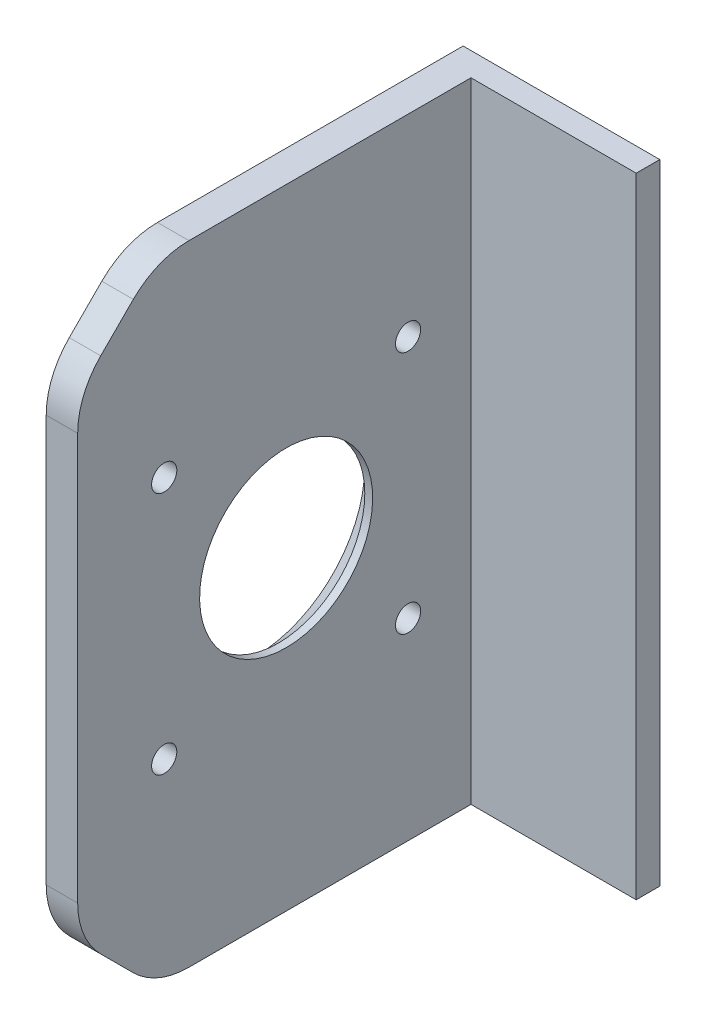
ISO-10303-21;
HEADER;
FILE_DESCRIPTION(('STEP AP214'),'2;1');
FILE_NAME('part.step','',(''),(''),'','','');
FILE_SCHEMA(('AUTOMOTIVE_DESIGN { 1 0 10303 214 1 1 1 1 }'));
ENDSEC;
DATA;
#1=APPLICATION_CONTEXT('core data for automotive mechanical design processes');
#2=APPLICATION_PROTOCOL_DEFINITION('international standard','automotive_design',2000,#1);
#3=PRODUCT_CONTEXT('',#1,'mechanical');
#4=PRODUCT('Part','Part','',(#3));
#5=PRODUCT_RELATED_PRODUCT_CATEGORY('part','',(#4));
#6=PRODUCT_DEFINITION_FORMATION('','',#4);
#7=PRODUCT_DEFINITION_CONTEXT('part definition',#1,'design');
#8=PRODUCT_DEFINITION('design','',#6,#7);
#9=PRODUCT_DEFINITION_SHAPE('','',#8);
#10=(LENGTH_UNIT() NAMED_UNIT(*) SI_UNIT(.MILLI.,.METRE.));
#11=(NAMED_UNIT(*) PLANE_ANGLE_UNIT() SI_UNIT($,.RADIAN.));
#12=(NAMED_UNIT(*) SI_UNIT($,.STERADIAN.) SOLID_ANGLE_UNIT());
#13=UNCERTAINTY_MEASURE_WITH_UNIT(LENGTH_MEASURE(1.E-05),#10,'distance_accuracy_value','');
#14=(GEOMETRIC_REPRESENTATION_CONTEXT(3) GLOBAL_UNCERTAINTY_ASSIGNED_CONTEXT((#13)) GLOBAL_UNIT_ASSIGNED_CONTEXT((#10,
#11,#12)) REPRESENTATION_CONTEXT('',''));
#15=CARTESIAN_POINT('',(0.,0.,0.));
#16=DIRECTION('',(0.,0.,1.));
#17=DIRECTION('',(1.,0.,0.));
#18=AXIS2_PLACEMENT_3D('',#15,#16,#17);
#19=CARTESIAN_POINT('',(-12.5,40.,3.));
#20=DIRECTION('',(1.,0.,0.));
#21=DIRECTION('',(0.,0.,-1.));
#22=AXIS2_PLACEMENT_3D('',#19,#20,#21);
#23=PLANE('',#22);
#24=CARTESIAN_POINT('',(-12.5,0.,26.5));
#25=DIRECTION('',(1.,0.,0.));
#26=DIRECTION('',(0.,0.,-1.));
#27=AXIS2_PLACEMENT_3D('',#24,#25,#26);
#28=CIRCLE('',#27,14.);
#29=CARTESIAN_POINT('',(-12.5,0.,12.5));
#30=VERTEX_POINT('',#29);
#31=EDGE_CURVE('E11',#30,#30,#28,.T.);
#32=ORIENTED_EDGE('',*,*,#31,.T.);
#33=EDGE_LOOP('',(#32));
#34=FACE_BOUND('',#33,.T.);
#35=CARTESIAN_POINT('',(-12.5,15.5,42.));
#36=DIRECTION('',(-1.,0.,0.));
#37=DIRECTION('',(0.,0.,1.));
#38=AXIS2_PLACEMENT_3D('',#35,#36,#37);
#39=CIRCLE('',#38,1.6);
#40=CARTESIAN_POINT('',(-12.5,15.5,43.6));
#41=VERTEX_POINT('',#40);
#42=EDGE_CURVE('E525',#41,#41,#39,.T.);
#43=ORIENTED_EDGE('',*,*,#42,.F.);
#44=EDGE_LOOP('',(#43));
#45=FACE_BOUND('',#44,.T.);
#46=CARTESIAN_POINT('',(-12.5,-15.5,11.));
#47=DIRECTION('',(-1.,0.,0.));
#48=DIRECTION('',(0.,0.,1.));
#49=AXIS2_PLACEMENT_3D('',#46,#47,#48);
#50=CIRCLE('',#49,1.6);
#51=CARTESIAN_POINT('',(-12.5,-15.5,12.6));
#52=VERTEX_POINT('',#51);
#53=EDGE_CURVE('E512',#52,#52,#50,.T.);
#54=ORIENTED_EDGE('',*,*,#53,.F.);
#55=EDGE_LOOP('',(#54));
#56=FACE_BOUND('',#55,.T.);
#57=CARTESIAN_POINT('',(-12.5,-15.5,42.));
#58=DIRECTION('',(-1.,0.,0.));
#59=DIRECTION('',(0.,0.,1.));
#60=AXIS2_PLACEMENT_3D('',#57,#58,#59);
#61=CIRCLE('',#60,1.6);
#62=CARTESIAN_POINT('',(-12.5,-15.5,43.6));
#63=VERTEX_POINT('',#62);
#64=EDGE_CURVE('E526',#63,#63,#61,.T.);
#65=ORIENTED_EDGE('',*,*,#64,.F.);
#66=EDGE_LOOP('',(#65));
#67=FACE_BOUND('',#66,.T.);
#68=CARTESIAN_POINT('',(-12.5,15.5,11.));
#69=DIRECTION('',(-1.,0.,0.));
#70=DIRECTION('',(0.,0.,1.));
#71=AXIS2_PLACEMENT_3D('',#68,#69,#70);
#72=CIRCLE('',#71,1.6);
#73=CARTESIAN_POINT('',(-12.5,15.5,12.6));
#74=VERTEX_POINT('',#73);
#75=EDGE_CURVE('E279',#74,#74,#72,.T.);
#76=ORIENTED_EDGE('',*,*,#75,.F.);
#77=EDGE_LOOP('',(#76));
#78=FACE_BOUND('',#77,.T.);
#79=DIRECTION('',(0.,0.,-1.));
#80=VECTOR('',#79,1.);
#81=CARTESIAN_POINT('',(-12.5,-40.,3.));
#82=LINE('',#81,#80);
#83=CARTESIAN_POINT('',(-12.5,-40.,38.857864376269));
#84=VERTEX_POINT('',#83);
#85=CARTESIAN_POINT('',(-12.5,-40.,0.));
#86=VERTEX_POINT('',#85);
#87=EDGE_CURVE('E209',#84,#86,#82,.T.);
#88=ORIENTED_EDGE('',*,*,#87,.F.);
#89=CARTESIAN_POINT('',(-12.5,-30.,38.857864376269));
#90=DIRECTION('',(1.,0.,0.));
#91=DIRECTION('',(0.,0.,-1.));
#92=AXIS2_PLACEMENT_3D('',#89,#90,#91);
#93=CIRCLE('',#92,10.);
#94=CARTESIAN_POINT('',(-12.5,-37.0710678118655,45.9289321881345));
#95=VERTEX_POINT('',#94);
#96=EDGE_CURVE('E239',#84,#95,#93,.F.);
#97=ORIENTED_EDGE('',*,*,#96,.T.);
#98=DIRECTION('',(0.,0.707106781186547,0.707106781186549));
#99=VECTOR('',#98,1.);
#100=CARTESIAN_POINT('',(-12.5,-30.,53.));
#101=LINE('',#100,#99);
#102=CARTESIAN_POINT('',(-12.5,-32.9289321881345,50.0710678118655));
#103=VERTEX_POINT('',#102);
#104=EDGE_CURVE('E222',#95,#103,#101,.T.);
#105=ORIENTED_EDGE('',*,*,#104,.T.);
#106=CARTESIAN_POINT('',(-12.5,-25.857864376269,43.));
#107=DIRECTION('',(1.,0.,0.));
#108=DIRECTION('',(0.,0.,-1.));
#109=AXIS2_PLACEMENT_3D('',#106,#107,#108);
#110=CIRCLE('',#109,10.);
#111=CARTESIAN_POINT('',(-12.5,-25.857864376269,53.));
#112=VERTEX_POINT('',#111);
#113=EDGE_CURVE('E236',#103,#112,#110,.F.);
#114=ORIENTED_EDGE('',*,*,#113,.T.);
#115=DIRECTION('',(0.,-1.,0.));
#116=VECTOR('',#115,1.);
#117=CARTESIAN_POINT('',(-12.5,40.,53.));
#118=LINE('',#117,#116);
#119=CARTESIAN_POINT('',(-12.5,25.857864376269,53.));
#120=VERTEX_POINT('',#119);
#121=EDGE_CURVE('E167',#120,#112,#118,.T.);
#122=ORIENTED_EDGE('',*,*,#121,.F.);
#123=CARTESIAN_POINT('',(-12.5,25.857864376269,43.));
#124=DIRECTION('',(1.,0.,0.));
#125=DIRECTION('',(0.,0.,-1.));
#126=AXIS2_PLACEMENT_3D('',#123,#124,#125);
#127=CIRCLE('',#126,10.);
#128=CARTESIAN_POINT('',(-12.5,32.9289321881345,50.0710678118655));
#129=VERTEX_POINT('',#128);
#130=EDGE_CURVE('E233',#120,#129,#127,.F.);
#131=ORIENTED_EDGE('',*,*,#130,.T.);
#132=DIRECTION('',(0.,0.707106781186547,-0.707106781186549));
#133=VECTOR('',#132,1.);
#134=CARTESIAN_POINT('',(-12.5,30.,53.));
#135=LINE('',#134,#133);
#136=CARTESIAN_POINT('',(-12.5,37.0710678118655,45.9289321881345));
#137=VERTEX_POINT('',#136);
#138=EDGE_CURVE('E218',#129,#137,#135,.T.);
#139=ORIENTED_EDGE('',*,*,#138,.T.);
#140=CARTESIAN_POINT('',(-12.5,30.,38.857864376269));
#141=DIRECTION('',(1.,0.,0.));
#142=DIRECTION('',(0.,0.,-1.));
#143=AXIS2_PLACEMENT_3D('',#140,#141,#142);
#144=CIRCLE('',#143,10.);
#145=CARTESIAN_POINT('',(-12.5,40.,38.857864376269));
#146=VERTEX_POINT('',#145);
#147=EDGE_CURVE('E230',#137,#146,#144,.F.);
#148=ORIENTED_EDGE('',*,*,#147,.T.);
#149=DIRECTION('',(0.,0.,-1.));
#150=VECTOR('',#149,1.);
#151=CARTESIAN_POINT('',(-12.5,40.,3.));
#152=LINE('',#151,#150);
#153=CARTESIAN_POINT('',(-12.5,40.,0.));
#154=VERTEX_POINT('',#153);
#155=EDGE_CURVE('E161',#146,#154,#152,.T.);
#156=ORIENTED_EDGE('',*,*,#155,.T.);
#157=DIRECTION('',(0.,-1.,0.));
#158=VECTOR('',#157,1.);
#159=CARTESIAN_POINT('',(-12.5,40.,0.));
#160=LINE('',#159,#158);
#161=EDGE_CURVE('E181',#154,#86,#160,.T.);
#162=ORIENTED_EDGE('',*,*,#161,.T.);
#163=EDGE_LOOP('',(#88,#97,#105,#114,#122,#131,#139,#148,#156,#162));
#164=FACE_BOUND('',#163,.T.);
#165=ADVANCED_FACE('F47',(#34,#45,#56,#67,#78,#164),#23,.F.);
#166=CARTESIAN_POINT('',(-12.5,-40.,3.));
#167=DIRECTION('',(0.,1.,0.));
#168=DIRECTION('',(-1.,0.,0.));
#169=AXIS2_PLACEMENT_3D('',#166,#167,#168);
#170=PLANE('',#169);
#171=DIRECTION('',(0.,0.,-1.));
#172=VECTOR('',#171,1.);
#173=CARTESIAN_POINT('',(-8.49999999999999,-40.,53.));
#174=LINE('',#173,#172);
#175=CARTESIAN_POINT('',(-8.49999999999999,-40.,38.857864376269));
#176=VERTEX_POINT('',#175);
#177=CARTESIAN_POINT('',(-8.5,-40.,3.));
#178=VERTEX_POINT('',#177);
#179=EDGE_CURVE('E149',#176,#178,#174,.T.);
#180=ORIENTED_EDGE('',*,*,#179,.F.);
#181=DIRECTION('',(-1.,0.,0.));
#182=VECTOR('',#181,1.);
#183=CARTESIAN_POINT('',(-12.5,-40.,38.857864376269));
#184=LINE('',#183,#182);
#185=EDGE_CURVE('E226',#176,#84,#184,.T.);
#186=ORIENTED_EDGE('',*,*,#185,.T.);
#187=ORIENTED_EDGE('',*,*,#87,.T.);
#188=DIRECTION('',(1.,0.,0.));
#189=VECTOR('',#188,1.);
#190=CARTESIAN_POINT('',(-12.5,-40.,0.));
#191=LINE('',#190,#189);
#192=CARTESIAN_POINT('',(12.5,-40.,0.));
#193=VERTEX_POINT('',#192);
#194=EDGE_CURVE('E191',#86,#193,#191,.T.);
#195=ORIENTED_EDGE('',*,*,#194,.T.);
#196=DIRECTION('',(0.,0.,-1.));
#197=VECTOR('',#196,1.);
#198=CARTESIAN_POINT('',(12.5,-40.,3.));
#199=LINE('',#198,#197);
#200=CARTESIAN_POINT('',(12.5,-40.,3.));
#201=VERTEX_POINT('',#200);
#202=EDGE_CURVE('E205',#201,#193,#199,.T.);
#203=ORIENTED_EDGE('',*,*,#202,.F.);
#204=DIRECTION('',(1.,0.,0.));
#205=VECTOR('',#204,1.);
#206=CARTESIAN_POINT('',(-12.5,-40.,3.));
#207=LINE('',#206,#205);
#208=EDGE_CURVE('E182',#178,#201,#207,.T.);
#209=ORIENTED_EDGE('',*,*,#208,.F.);
#210=EDGE_LOOP('',(#180,#186,#187,#195,#203,#209));
#211=FACE_BOUND('',#210,.T.);
#212=ADVANCED_FACE('F308',(#211),#170,.F.);
#213=CARTESIAN_POINT('',(12.5,40.,3.));
#214=DIRECTION('',(-1.,0.,0.));
#215=DIRECTION('',(0.,0.,1.));
#216=AXIS2_PLACEMENT_3D('',#213,#214,#215);
#217=PLANE('',#216);
#218=DIRECTION('',(0.,1.,0.));
#219=VECTOR('',#218,1.);
#220=CARTESIAN_POINT('',(12.5,40.,0.));
#221=LINE('',#220,#219);
#222=CARTESIAN_POINT('',(12.5,40.,0.));
#223=VERTEX_POINT('',#222);
#224=EDGE_CURVE('E194',#193,#223,#221,.T.);
#225=ORIENTED_EDGE('',*,*,#224,.T.);
#226=DIRECTION('',(0.,0.,-1.));
#227=VECTOR('',#226,1.);
#228=CARTESIAN_POINT('',(12.5,40.,3.));
#229=LINE('',#228,#227);
#230=CARTESIAN_POINT('',(12.5,40.,3.));
#231=VERTEX_POINT('',#230);
#232=EDGE_CURVE('E202',#231,#223,#229,.T.);
#233=ORIENTED_EDGE('',*,*,#232,.F.);
#234=DIRECTION('',(0.,1.,0.));
#235=VECTOR('',#234,1.);
#236=CARTESIAN_POINT('',(12.5,40.,3.));
#237=LINE('',#236,#235);
#238=EDGE_CURVE('E158',#201,#231,#237,.T.);
#239=ORIENTED_EDGE('',*,*,#238,.F.);
#240=ORIENTED_EDGE('',*,*,#202,.T.);
#241=EDGE_LOOP('',(#225,#233,#239,#240));
#242=FACE_BOUND('',#241,.T.);
#243=ADVANCED_FACE('F314',(#242),#217,.F.);
#244=CARTESIAN_POINT('',(-12.5,40.,3.));
#245=DIRECTION('',(0.,-1.,0.));
#246=DIRECTION('',(0.,0.,-1.));
#247=AXIS2_PLACEMENT_3D('',#244,#245,#246);
#248=PLANE('',#247);
#249=ORIENTED_EDGE('',*,*,#155,.F.);
#250=DIRECTION('',(1.,0.,0.));
#251=VECTOR('',#250,1.);
#252=CARTESIAN_POINT('',(-8.5,40.,38.857864376269));
#253=LINE('',#252,#251);
#254=CARTESIAN_POINT('',(-8.5,40.,38.857864376269));
#255=VERTEX_POINT('',#254);
#256=EDGE_CURVE('E146',#146,#255,#253,.T.);
#257=ORIENTED_EDGE('',*,*,#256,.T.);
#258=DIRECTION('',(0.,0.,-1.));
#259=VECTOR('',#258,1.);
#260=CARTESIAN_POINT('',(-8.5,40.,53.));
#261=LINE('',#260,#259);
#262=CARTESIAN_POINT('',(-8.5,40.,3.));
#263=VERTEX_POINT('',#262);
#264=EDGE_CURVE('E139',#255,#263,#261,.T.);
#265=ORIENTED_EDGE('',*,*,#264,.T.);
#266=DIRECTION('',(-1.,0.,0.));
#267=VECTOR('',#266,1.);
#268=CARTESIAN_POINT('',(-12.5,40.,3.));
#269=LINE('',#268,#267);
#270=EDGE_CURVE('E144',#231,#263,#269,.T.);
#271=ORIENTED_EDGE('',*,*,#270,.F.);
#272=ORIENTED_EDGE('',*,*,#232,.T.);
#273=DIRECTION('',(-1.,0.,0.));
#274=VECTOR('',#273,1.);
#275=CARTESIAN_POINT('',(-12.5,40.,0.));
#276=LINE('',#275,#274);
#277=EDGE_CURVE('E185',#223,#154,#276,.T.);
#278=ORIENTED_EDGE('',*,*,#277,.T.);
#279=EDGE_LOOP('',(#249,#257,#265,#271,#272,#278));
#280=FACE_BOUND('',#279,.T.);
#281=ADVANCED_FACE('F142',(#280),#248,.F.);
#282=CARTESIAN_POINT('',(0.,0.,3.));
#283=DIRECTION('',(0.,0.,1.));
#284=DIRECTION('',(1.,0.,0.));
#285=AXIS2_PLACEMENT_3D('',#282,#283,#284);
#286=PLANE('',#285);
#287=DIRECTION('',(0.,1.,0.));
#288=VECTOR('',#287,1.);
#289=CARTESIAN_POINT('',(-8.5,40.,3.));
#290=LINE('',#289,#288);
#291=EDGE_CURVE('E155',#178,#263,#290,.T.);
#292=ORIENTED_EDGE('',*,*,#291,.F.);
#293=ORIENTED_EDGE('',*,*,#208,.T.);
#294=ORIENTED_EDGE('',*,*,#238,.T.);
#295=ORIENTED_EDGE('',*,*,#270,.T.);
#296=EDGE_LOOP('',(#292,#293,#294,#295));
#297=FACE_BOUND('',#296,.T.);
#298=ADVANCED_FACE('F154',(#297),#286,.T.);
#299=CARTESIAN_POINT('',(0.,0.,0.));
#300=DIRECTION('',(0.,0.,1.));
#301=DIRECTION('',(1.,0.,0.));
#302=AXIS2_PLACEMENT_3D('',#299,#300,#301);
#303=PLANE('',#302);
#304=ORIENTED_EDGE('',*,*,#161,.F.);
#305=ORIENTED_EDGE('',*,*,#277,.F.);
#306=ORIENTED_EDGE('',*,*,#224,.F.);
#307=ORIENTED_EDGE('',*,*,#194,.F.);
#308=EDGE_LOOP('',(#304,#305,#306,#307));
#309=FACE_BOUND('',#308,.T.);
#310=ADVANCED_FACE('F364',(#309),#303,.F.);
#311=CARTESIAN_POINT('',(-8.5,40.,53.));
#312=DIRECTION('',(-1.,0.,0.));
#313=DIRECTION('',(0.,-1.,0.));
#314=AXIS2_PLACEMENT_3D('',#311,#312,#313);
#315=PLANE('',#314);
#316=CARTESIAN_POINT('',(-8.5,15.5,42.));
#317=DIRECTION('',(-1.,0.,0.));
#318=DIRECTION('',(0.,-1.,0.));
#319=AXIS2_PLACEMENT_3D('',#316,#317,#318);
#320=CIRCLE('',#319,1.6);
#321=CARTESIAN_POINT('',(-8.5,13.9,42.));
#322=VERTEX_POINT('',#321);
#323=EDGE_CURVE('E168',#322,#322,#320,.T.);
#324=ORIENTED_EDGE('',*,*,#323,.T.);
#325=EDGE_LOOP('',(#324));
#326=FACE_BOUND('',#325,.T.);
#327=CARTESIAN_POINT('',(-8.49999999999999,-15.5,11.));
#328=DIRECTION('',(-1.,0.,0.));
#329=DIRECTION('',(0.,-1.,0.));
#330=AXIS2_PLACEMENT_3D('',#327,#328,#329);
#331=CIRCLE('',#330,1.6);
#332=CARTESIAN_POINT('',(-8.49999999999999,-17.1,11.));
#333=VERTEX_POINT('',#332);
#334=EDGE_CURVE('E175',#333,#333,#331,.T.);
#335=ORIENTED_EDGE('',*,*,#334,.T.);
#336=EDGE_LOOP('',(#335));
#337=FACE_BOUND('',#336,.T.);
#338=CARTESIAN_POINT('',(-8.49999999999999,-15.5,42.));
#339=DIRECTION('',(-1.,0.,0.));
#340=DIRECTION('',(0.,-1.,0.));
#341=AXIS2_PLACEMENT_3D('',#338,#339,#340);
#342=CIRCLE('',#341,1.6);
#343=CARTESIAN_POINT('',(-8.49999999999999,-17.1,42.));
#344=VERTEX_POINT('',#343);
#345=EDGE_CURVE('E283',#344,#344,#342,.T.);
#346=ORIENTED_EDGE('',*,*,#345,.T.);
#347=EDGE_LOOP('',(#346));
#348=FACE_BOUND('',#347,.T.);
#349=CARTESIAN_POINT('',(-8.49999999999999,0.,26.5));
#350=DIRECTION('',(-1.,0.,0.));
#351=DIRECTION('',(0.,-1.,0.));
#352=AXIS2_PLACEMENT_3D('',#349,#350,#351);
#353=CIRCLE('',#352,11.);
#354=CARTESIAN_POINT('',(-8.49999999999999,-11.,26.5));
#355=VERTEX_POINT('',#354);
#356=EDGE_CURVE('E278',#355,#355,#353,.T.);
#357=ORIENTED_EDGE('',*,*,#356,.T.);
#358=EDGE_LOOP('',(#357));
#359=FACE_BOUND('',#358,.T.);
#360=CARTESIAN_POINT('',(-8.5,15.5,11.));
#361=DIRECTION('',(-1.,0.,0.));
#362=DIRECTION('',(0.,-1.,0.));
#363=AXIS2_PLACEMENT_3D('',#360,#361,#362);
#364=CIRCLE('',#363,1.6);
#365=CARTESIAN_POINT('',(-8.5,13.9,11.));
#366=VERTEX_POINT('',#365);
#367=EDGE_CURVE('E274',#366,#366,#364,.T.);
#368=ORIENTED_EDGE('',*,*,#367,.T.);
#369=EDGE_LOOP('',(#368));
#370=FACE_BOUND('',#369,.T.);
#371=DIRECTION('',(0.,-0.707106781186547,-0.707106781186549));
#372=VECTOR('',#371,1.);
#373=CARTESIAN_POINT('',(-8.49999999999999,-30.,53.));
#374=LINE('',#373,#372);
#375=CARTESIAN_POINT('',(-8.49999999999999,-32.9289321881345,50.0710678118655));
#376=VERTEX_POINT('',#375);
#377=CARTESIAN_POINT('',(-8.49999999999999,-37.0710678118655,45.9289321881345));
#378=VERTEX_POINT('',#377);
#379=EDGE_CURVE('E215',#376,#378,#374,.T.);
#380=ORIENTED_EDGE('',*,*,#379,.T.);
#381=CARTESIAN_POINT('',(-8.49999999999999,-30.,38.857864376269));
#382=DIRECTION('',(-1.,0.,0.));
#383=DIRECTION('',(0.,-1.,0.));
#384=AXIS2_PLACEMENT_3D('',#381,#382,#383);
#385=CIRCLE('',#384,10.);
#386=EDGE_CURVE('E256',#378,#176,#385,.F.);
#387=ORIENTED_EDGE('',*,*,#386,.T.);
#388=ORIENTED_EDGE('',*,*,#179,.T.);
#389=ORIENTED_EDGE('',*,*,#291,.T.);
#390=ORIENTED_EDGE('',*,*,#264,.F.);
#391=CARTESIAN_POINT('',(-8.5,30.,38.857864376269));
#392=DIRECTION('',(-1.,0.,0.));
#393=DIRECTION('',(0.,-1.,0.));
#394=AXIS2_PLACEMENT_3D('',#391,#392,#393);
#395=CIRCLE('',#394,10.);
#396=CARTESIAN_POINT('',(-8.5,37.0710678118655,45.9289321881345));
#397=VERTEX_POINT('',#396);
#398=EDGE_CURVE('E71',#255,#397,#395,.F.);
#399=ORIENTED_EDGE('',*,*,#398,.T.);
#400=DIRECTION('',(0.,-0.707106781186547,0.707106781186549));
#401=VECTOR('',#400,1.);
#402=CARTESIAN_POINT('',(-8.5,30.,53.));
#403=LINE('',#402,#401);
#404=CARTESIAN_POINT('',(-8.5,32.9289321881345,50.0710678118655));
#405=VERTEX_POINT('',#404);
#406=EDGE_CURVE('E212',#397,#405,#403,.T.);
#407=ORIENTED_EDGE('',*,*,#406,.T.);
#408=CARTESIAN_POINT('',(-8.5,25.857864376269,43.));
#409=DIRECTION('',(-1.,0.,0.));
#410=DIRECTION('',(0.,-1.,0.));
#411=AXIS2_PLACEMENT_3D('',#408,#409,#410);
#412=CIRCLE('',#411,10.);
#413=CARTESIAN_POINT('',(-8.5,25.857864376269,53.));
#414=VERTEX_POINT('',#413);
#415=EDGE_CURVE('E250',#405,#414,#412,.F.);
#416=ORIENTED_EDGE('',*,*,#415,.T.);
#417=DIRECTION('',(0.,1.,0.));
#418=VECTOR('',#417,1.);
#419=CARTESIAN_POINT('',(-8.5,40.,53.));
#420=LINE('',#419,#418);
#421=CARTESIAN_POINT('',(-8.49999999999999,-25.857864376269,53.));
#422=VERTEX_POINT('',#421);
#423=EDGE_CURVE('E150',#422,#414,#420,.T.);
#424=ORIENTED_EDGE('',*,*,#423,.F.);
#425=CARTESIAN_POINT('',(-8.49999999999999,-25.857864376269,43.));
#426=DIRECTION('',(-1.,0.,0.));
#427=DIRECTION('',(0.,-1.,0.));
#428=AXIS2_PLACEMENT_3D('',#425,#426,#427);
#429=CIRCLE('',#428,10.);
#430=EDGE_CURVE('E253',#422,#376,#429,.F.);
#431=ORIENTED_EDGE('',*,*,#430,.T.);
#432=EDGE_LOOP('',(#380,#387,#388,#389,#390,#399,#407,#416,#424,#431));
#433=FACE_BOUND('',#432,.T.);
#434=ADVANCED_FACE('F164',(#326,#337,#348,#359,#370,#433),#315,.F.);
#435=CARTESIAN_POINT('',(0.,0.,53.));
#436=DIRECTION('',(0.,0.,1.));
#437=DIRECTION('',(1.,0.,0.));
#438=AXIS2_PLACEMENT_3D('',#435,#436,#437);
#439=PLANE('',#438);
#440=ORIENTED_EDGE('',*,*,#121,.T.);
#441=DIRECTION('',(1.,0.,0.));
#442=VECTOR('',#441,1.);
#443=CARTESIAN_POINT('',(0.,-25.857864376269,53.));
#444=LINE('',#443,#442);
#445=EDGE_CURVE('E263',#112,#422,#444,.T.);
#446=ORIENTED_EDGE('',*,*,#445,.T.);
#447=ORIENTED_EDGE('',*,*,#423,.T.);
#448=DIRECTION('',(-1.,0.,0.));
#449=VECTOR('',#448,1.);
#450=CARTESIAN_POINT('',(0.,25.857864376269,53.));
#451=LINE('',#450,#449);
#452=EDGE_CURVE('E259',#414,#120,#451,.T.);
#453=ORIENTED_EDGE('',*,*,#452,.T.);
#454=EDGE_LOOP('',(#440,#446,#447,#453));
#455=FACE_BOUND('',#454,.T.);
#456=ADVANCED_FACE('F328',(#455),#439,.T.);
#457=CARTESIAN_POINT('',(0.,-30.,53.));
#458=DIRECTION('',(0.,-0.707106781186549,0.707106781186547));
#459=DIRECTION('',(-1.,0.,0.));
#460=AXIS2_PLACEMENT_3D('',#457,#458,#459);
#461=PLANE('',#460);
#462=ORIENTED_EDGE('',*,*,#104,.F.);
#463=DIRECTION('',(-1.,0.,0.));
#464=VECTOR('',#463,1.);
#465=CARTESIAN_POINT('',(-8.49999999999999,-37.0710678118655,45.9289321881345));
#466=LINE('',#465,#464);
#467=EDGE_CURVE('E245',#95,#378,#466,.F.);
#468=ORIENTED_EDGE('',*,*,#467,.T.);
#469=ORIENTED_EDGE('',*,*,#379,.F.);
#470=DIRECTION('',(1.,0.,0.));
#471=VECTOR('',#470,1.);
#472=CARTESIAN_POINT('',(0.,-32.9289321881345,50.0710678118655));
#473=LINE('',#472,#471);
#474=EDGE_CURVE('E242',#376,#103,#473,.F.);
#475=ORIENTED_EDGE('',*,*,#474,.T.);
#476=EDGE_LOOP('',(#462,#468,#469,#475));
#477=FACE_BOUND('',#476,.T.);
#478=ADVANCED_FACE('F321',(#477),#461,.T.);
#479=CARTESIAN_POINT('',(0.,30.,53.));
#480=DIRECTION('',(0.,0.707106781186549,0.707106781186547));
#481=DIRECTION('',(1.,0.,0.));
#482=AXIS2_PLACEMENT_3D('',#479,#480,#481);
#483=PLANE('',#482);
#484=ORIENTED_EDGE('',*,*,#138,.F.);
#485=DIRECTION('',(-1.,0.,0.));
#486=VECTOR('',#485,1.);
#487=CARTESIAN_POINT('',(0.,32.9289321881345,50.0710678118655));
#488=LINE('',#487,#486);
#489=EDGE_CURVE('E64',#129,#405,#488,.F.);
#490=ORIENTED_EDGE('',*,*,#489,.T.);
#491=ORIENTED_EDGE('',*,*,#406,.F.);
#492=DIRECTION('',(1.,0.,0.));
#493=VECTOR('',#492,1.);
#494=CARTESIAN_POINT('',(-12.5,37.0710678118655,45.9289321881345));
#495=LINE('',#494,#493);
#496=EDGE_CURVE('E267',#397,#137,#495,.F.);
#497=ORIENTED_EDGE('',*,*,#496,.T.);
#498=EDGE_LOOP('',(#484,#490,#491,#497));
#499=FACE_BOUND('',#498,.T.);
#500=ADVANCED_FACE('F327',(#499),#483,.T.);
#501=CARTESIAN_POINT('',(-12.5,-30.,38.857864376269));
#502=DIRECTION('',(1.,0.,0.));
#503=DIRECTION('',(0.,1.,0.));
#504=AXIS2_PLACEMENT_3D('',#501,#502,#503);
#505=CYLINDRICAL_SURFACE('',#504,10.);
#506=ORIENTED_EDGE('',*,*,#386,.F.);
#507=ORIENTED_EDGE('',*,*,#467,.F.);
#508=ORIENTED_EDGE('',*,*,#96,.F.);
#509=ORIENTED_EDGE('',*,*,#185,.F.);
#510=EDGE_LOOP('',(#506,#507,#508,#509));
#511=FACE_BOUND('',#510,.T.);
#512=ADVANCED_FACE('F334',(#511),#505,.T.);
#513=CARTESIAN_POINT('',(0.,-25.857864376269,43.));
#514=DIRECTION('',(1.,0.,0.));
#515=DIRECTION('',(0.,1.,0.));
#516=AXIS2_PLACEMENT_3D('',#513,#514,#515);
#517=CYLINDRICAL_SURFACE('',#516,10.);
#518=ORIENTED_EDGE('',*,*,#113,.F.);
#519=ORIENTED_EDGE('',*,*,#474,.F.);
#520=ORIENTED_EDGE('',*,*,#430,.F.);
#521=ORIENTED_EDGE('',*,*,#445,.F.);
#522=EDGE_LOOP('',(#518,#519,#520,#521));
#523=FACE_BOUND('',#522,.T.);
#524=ADVANCED_FACE('F337',(#523),#517,.T.);
#525=CARTESIAN_POINT('',(0.,25.857864376269,43.));
#526=DIRECTION('',(-1.,0.,0.));
#527=DIRECTION('',(0.,0.,1.));
#528=AXIS2_PLACEMENT_3D('',#525,#526,#527);
#529=CYLINDRICAL_SURFACE('',#528,10.);
#530=ORIENTED_EDGE('',*,*,#415,.F.);
#531=ORIENTED_EDGE('',*,*,#489,.F.);
#532=ORIENTED_EDGE('',*,*,#130,.F.);
#533=ORIENTED_EDGE('',*,*,#452,.F.);
#534=EDGE_LOOP('',(#530,#531,#532,#533));
#535=FACE_BOUND('',#534,.T.);
#536=ADVANCED_FACE('F341',(#535),#529,.T.);
#537=CARTESIAN_POINT('',(-12.5,30.,38.857864376269));
#538=DIRECTION('',(-1.,0.,0.));
#539=DIRECTION('',(0.,0.,1.));
#540=AXIS2_PLACEMENT_3D('',#537,#538,#539);
#541=CYLINDRICAL_SURFACE('',#540,10.);
#542=ORIENTED_EDGE('',*,*,#147,.F.);
#543=ORIENTED_EDGE('',*,*,#496,.F.);
#544=ORIENTED_EDGE('',*,*,#398,.F.);
#545=ORIENTED_EDGE('',*,*,#256,.F.);
#546=EDGE_LOOP('',(#542,#543,#544,#545));
#547=FACE_BOUND('',#546,.T.);
#548=ADVANCED_FACE('F344',(#547),#541,.T.);
#549=CARTESIAN_POINT('',(37.5,15.5,11.));
#550=DIRECTION('',(-1.,0.,0.));
#551=DIRECTION('',(0.,0.,1.));
#552=AXIS2_PLACEMENT_3D('',#549,#550,#551);
#553=CYLINDRICAL_SURFACE('',#552,1.6);
#554=ORIENTED_EDGE('',*,*,#75,.T.);
#555=EDGE_LOOP('',(#554));
#556=FACE_BOUND('',#555,.T.);
#557=ORIENTED_EDGE('',*,*,#367,.F.);
#558=EDGE_LOOP('',(#557));
#559=FACE_BOUND('',#558,.T.);
#560=ADVANCED_FACE('F347',(#556,#559),#553,.F.);
#561=CARTESIAN_POINT('',(37.5,0.,26.5));
#562=DIRECTION('',(-1.,0.,0.));
#563=DIRECTION('',(0.,0.,1.));
#564=AXIS2_PLACEMENT_3D('',#561,#562,#563);
#565=CYLINDRICAL_SURFACE('',#564,11.);
#566=CARTESIAN_POINT('',(-9.5,0.,26.5));
#567=DIRECTION('',(1.,0.,0.));
#568=DIRECTION('',(0.,0.,-1.));
#569=AXIS2_PLACEMENT_3D('',#566,#567,#568);
#570=CIRCLE('',#569,11.);
#571=CARTESIAN_POINT('',(-9.5,0.,15.5));
#572=VERTEX_POINT('',#571);
#573=EDGE_CURVE('E57',#572,#572,#570,.F.);
#574=ORIENTED_EDGE('',*,*,#573,.T.);
#575=EDGE_LOOP('',(#574));
#576=FACE_BOUND('',#575,.T.);
#577=ORIENTED_EDGE('',*,*,#356,.F.);
#578=EDGE_LOOP('',(#577));
#579=FACE_BOUND('',#578,.T.);
#580=ADVANCED_FACE('F293',(#576,#579),#565,.F.);
#581=CARTESIAN_POINT('',(37.5,-15.5,42.));
#582=DIRECTION('',(-1.,0.,0.));
#583=DIRECTION('',(0.,0.,1.));
#584=AXIS2_PLACEMENT_3D('',#581,#582,#583);
#585=CYLINDRICAL_SURFACE('',#584,1.6);
#586=ORIENTED_EDGE('',*,*,#64,.T.);
#587=EDGE_LOOP('',(#586));
#588=FACE_BOUND('',#587,.T.);
#589=ORIENTED_EDGE('',*,*,#345,.F.);
#590=EDGE_LOOP('',(#589));
#591=FACE_BOUND('',#590,.T.);
#592=ADVANCED_FACE('F480',(#588,#591),#585,.F.);
#593=CARTESIAN_POINT('',(37.5,-15.5,11.));
#594=DIRECTION('',(-1.,0.,0.));
#595=DIRECTION('',(0.,0.,1.));
#596=AXIS2_PLACEMENT_3D('',#593,#594,#595);
#597=CYLINDRICAL_SURFACE('',#596,1.6);
#598=ORIENTED_EDGE('',*,*,#53,.T.);
#599=EDGE_LOOP('',(#598));
#600=FACE_BOUND('',#599,.T.);
#601=ORIENTED_EDGE('',*,*,#334,.F.);
#602=EDGE_LOOP('',(#601));
#603=FACE_BOUND('',#602,.T.);
#604=ADVANCED_FACE('F303',(#600,#603),#597,.F.);
#605=CARTESIAN_POINT('',(37.5,15.5,42.));
#606=DIRECTION('',(-1.,0.,0.));
#607=DIRECTION('',(0.,0.,1.));
#608=AXIS2_PLACEMENT_3D('',#605,#606,#607);
#609=CYLINDRICAL_SURFACE('',#608,1.6);
#610=ORIENTED_EDGE('',*,*,#42,.T.);
#611=EDGE_LOOP('',(#610));
#612=FACE_BOUND('',#611,.T.);
#613=ORIENTED_EDGE('',*,*,#323,.F.);
#614=EDGE_LOOP('',(#613));
#615=FACE_BOUND('',#614,.T.);
#616=ADVANCED_FACE('F297',(#612,#615),#609,.F.);
#617=CARTESIAN_POINT('',(-9.5,0.,26.5));
#618=DIRECTION('',(-1.,0.,0.));
#619=DIRECTION('',(0.,0.,1.));
#620=AXIS2_PLACEMENT_3D('',#617,#618,#619);
#621=CONICAL_SURFACE('',#620,11.,0.785398163397451);
#622=ORIENTED_EDGE('',*,*,#31,.F.);
#623=EDGE_LOOP('',(#622));
#624=FACE_BOUND('',#623,.T.);
#625=ORIENTED_EDGE('',*,*,#573,.F.);
#626=EDGE_LOOP('',(#625));
#627=FACE_BOUND('',#626,.T.);
#628=ADVANCED_FACE('F50',(#624,#627),#621,.F.);
#629=CLOSED_SHELL('',(#165,#212,#243,#281,#298,#310,#434,#456,#478,#500,#512,#524,#536,#548,
#560,#580,#592,#604,#616,#628));
#630=MANIFOLD_SOLID_BREP('B2',#629);
#631=ADVANCED_BREP_SHAPE_REPRESENTATION('',(#18,#630),#14);
#632=SHAPE_DEFINITION_REPRESENTATION(#9,#631);
ENDSEC;
END-ISO-10303-21;
